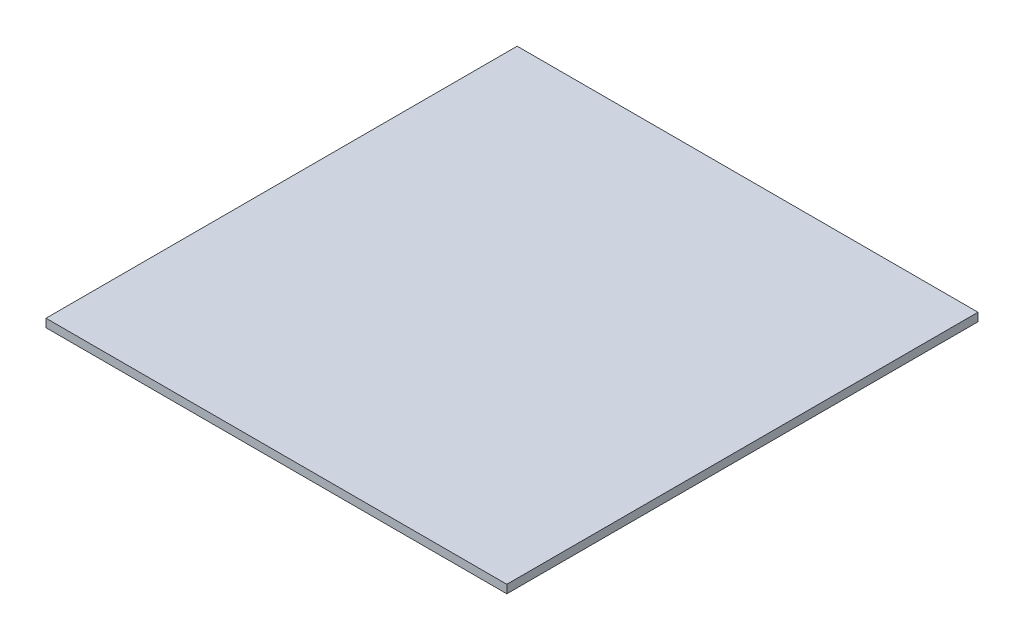
ISO-10303-21;
HEADER;
FILE_DESCRIPTION(('STEP AP214'),'2;1');
FILE_NAME('part.step','',(''),(''),'','','');
FILE_SCHEMA(('AUTOMOTIVE_DESIGN { 1 0 10303 214 1 1 1 1 }'));
ENDSEC;
DATA;
#1=APPLICATION_CONTEXT('core data for automotive mechanical design processes');
#2=APPLICATION_PROTOCOL_DEFINITION('international standard','automotive_design',2000,#1);
#3=PRODUCT_CONTEXT('',#1,'mechanical');
#4=PRODUCT('Part','Part','',(#3));
#5=PRODUCT_RELATED_PRODUCT_CATEGORY('part','',(#4));
#6=PRODUCT_DEFINITION_FORMATION('','',#4);
#7=PRODUCT_DEFINITION_CONTEXT('part definition',#1,'design');
#8=PRODUCT_DEFINITION('design','',#6,#7);
#9=PRODUCT_DEFINITION_SHAPE('','',#8);
#10=(LENGTH_UNIT() NAMED_UNIT(*) SI_UNIT(.MILLI.,.METRE.));
#11=(NAMED_UNIT(*) PLANE_ANGLE_UNIT() SI_UNIT($,.RADIAN.));
#12=(NAMED_UNIT(*) SI_UNIT($,.STERADIAN.) SOLID_ANGLE_UNIT());
#13=UNCERTAINTY_MEASURE_WITH_UNIT(LENGTH_MEASURE(1.E-05),#10,'distance_accuracy_value','');
#14=(GEOMETRIC_REPRESENTATION_CONTEXT(3) GLOBAL_UNCERTAINTY_ASSIGNED_CONTEXT((#13)) GLOBAL_UNIT_ASSIGNED_CONTEXT((#10,
#11,#12)) REPRESENTATION_CONTEXT('',''));
#15=CARTESIAN_POINT('',(0.,0.,0.));
#16=DIRECTION('',(0.,0.,1.));
#17=DIRECTION('',(1.,0.,0.));
#18=AXIS2_PLACEMENT_3D('',#15,#16,#17);
#19=CARTESIAN_POINT('',(0.,8.,0.));
#20=DIRECTION('',(1.,0.,0.));
#21=DIRECTION('',(0.,0.,-1.));
#22=AXIS2_PLACEMENT_3D('',#19,#20,#21);
#23=PLANE('',#22);
#24=DIRECTION('',(0.,0.,1.));
#25=VECTOR('',#24,1.);
#26=CARTESIAN_POINT('',(0.,0.,0.));
#27=LINE('',#26,#25);
#28=CARTESIAN_POINT('',(0.,0.,-455.));
#29=VERTEX_POINT('',#28);
#30=CARTESIAN_POINT('',(0.,0.,0.));
#31=VERTEX_POINT('',#30);
#32=EDGE_CURVE('E96',#29,#31,#27,.T.);
#33=ORIENTED_EDGE('',*,*,#32,.T.);
#34=DIRECTION('',(0.,-1.,0.));
#35=VECTOR('',#34,1.);
#36=CARTESIAN_POINT('',(0.,8.,0.));
#37=LINE('',#36,#35);
#38=CARTESIAN_POINT('',(0.,8.,0.));
#39=VERTEX_POINT('',#38);
#40=EDGE_CURVE('E11',#39,#31,#37,.T.);
#41=ORIENTED_EDGE('',*,*,#40,.F.);
#42=DIRECTION('',(0.,0.,1.));
#43=VECTOR('',#42,1.);
#44=CARTESIAN_POINT('',(0.,8.,0.));
#45=LINE('',#44,#43);
#46=CARTESIAN_POINT('',(0.,8.,-455.));
#47=VERTEX_POINT('',#46);
#48=EDGE_CURVE('E84',#47,#39,#45,.T.);
#49=ORIENTED_EDGE('',*,*,#48,.F.);
#50=DIRECTION('',(0.,-1.,0.));
#51=VECTOR('',#50,1.);
#52=CARTESIAN_POINT('',(0.,8.,-455.));
#53=LINE('',#52,#51);
#54=EDGE_CURVE('E92',#47,#29,#53,.T.);
#55=ORIENTED_EDGE('',*,*,#54,.T.);
#56=EDGE_LOOP('',(#33,#41,#49,#55));
#57=FACE_BOUND('',#56,.T.);
#58=ADVANCED_FACE('F33',(#57),#23,.F.);
#59=CARTESIAN_POINT('',(0.,8.,0.));
#60=DIRECTION('',(0.,0.,-1.));
#61=DIRECTION('',(-1.,0.,0.));
#62=AXIS2_PLACEMENT_3D('',#59,#60,#61);
#63=PLANE('',#62);
#64=DIRECTION('',(1.,0.,0.));
#65=VECTOR('',#64,1.);
#66=CARTESIAN_POINT('',(0.,0.,0.));
#67=LINE('',#66,#65);
#68=CARTESIAN_POINT('',(445.,0.,0.));
#69=VERTEX_POINT('',#68);
#70=EDGE_CURVE('E88',#31,#69,#67,.T.);
#71=ORIENTED_EDGE('',*,*,#70,.T.);
#72=DIRECTION('',(0.,-1.,0.));
#73=VECTOR('',#72,1.);
#74=CARTESIAN_POINT('',(445.,8.,0.));
#75=LINE('',#74,#73);
#76=CARTESIAN_POINT('',(445.,8.,0.));
#77=VERTEX_POINT('',#76);
#78=EDGE_CURVE('E41',#77,#69,#75,.T.);
#79=ORIENTED_EDGE('',*,*,#78,.F.);
#80=DIRECTION('',(1.,0.,0.));
#81=VECTOR('',#80,1.);
#82=CARTESIAN_POINT('',(0.,8.,0.));
#83=LINE('',#82,#81);
#84=EDGE_CURVE('E79',#39,#77,#83,.T.);
#85=ORIENTED_EDGE('',*,*,#84,.F.);
#86=ORIENTED_EDGE('',*,*,#40,.T.);
#87=EDGE_LOOP('',(#71,#79,#85,#86));
#88=FACE_BOUND('',#87,.T.);
#89=ADVANCED_FACE('F87',(#88),#63,.F.);
#90=CARTESIAN_POINT('',(445.,8.,0.));
#91=DIRECTION('',(-1.,0.,0.));
#92=DIRECTION('',(0.,0.,1.));
#93=AXIS2_PLACEMENT_3D('',#90,#91,#92);
#94=PLANE('',#93);
#95=DIRECTION('',(0.,0.,-1.));
#96=VECTOR('',#95,1.);
#97=CARTESIAN_POINT('',(445.,0.,0.));
#98=LINE('',#97,#96);
#99=CARTESIAN_POINT('',(445.,0.,-455.));
#100=VERTEX_POINT('',#99);
#101=EDGE_CURVE('E66',#69,#100,#98,.T.);
#102=ORIENTED_EDGE('',*,*,#101,.T.);
#103=DIRECTION('',(0.,-1.,0.));
#104=VECTOR('',#103,1.);
#105=CARTESIAN_POINT('',(445.,8.,-455.));
#106=LINE('',#105,#104);
#107=CARTESIAN_POINT('',(445.,8.,-455.));
#108=VERTEX_POINT('',#107);
#109=EDGE_CURVE('E89',#108,#100,#106,.T.);
#110=ORIENTED_EDGE('',*,*,#109,.F.);
#111=DIRECTION('',(0.,0.,-1.));
#112=VECTOR('',#111,1.);
#113=CARTESIAN_POINT('',(445.,8.,0.));
#114=LINE('',#113,#112);
#115=EDGE_CURVE('E82',#77,#108,#114,.T.);
#116=ORIENTED_EDGE('',*,*,#115,.F.);
#117=ORIENTED_EDGE('',*,*,#78,.T.);
#118=EDGE_LOOP('',(#102,#110,#116,#117));
#119=FACE_BOUND('',#118,.T.);
#120=ADVANCED_FACE('F90',(#119),#94,.F.);
#121=CARTESIAN_POINT('',(0.,8.,-455.));
#122=DIRECTION('',(0.,0.,1.));
#123=DIRECTION('',(1.,0.,0.));
#124=AXIS2_PLACEMENT_3D('',#121,#122,#123);
#125=PLANE('',#124);
#126=DIRECTION('',(-1.,0.,0.));
#127=VECTOR('',#126,1.);
#128=CARTESIAN_POINT('',(0.,0.,-455.));
#129=LINE('',#128,#127);
#130=EDGE_CURVE('E72',#100,#29,#129,.T.);
#131=ORIENTED_EDGE('',*,*,#130,.T.);
#132=ORIENTED_EDGE('',*,*,#54,.F.);
#133=DIRECTION('',(-1.,0.,0.));
#134=VECTOR('',#133,1.);
#135=CARTESIAN_POINT('',(0.,8.,-455.));
#136=LINE('',#135,#134);
#137=EDGE_CURVE('E49',#108,#47,#136,.T.);
#138=ORIENTED_EDGE('',*,*,#137,.F.);
#139=ORIENTED_EDGE('',*,*,#109,.T.);
#140=EDGE_LOOP('',(#131,#132,#138,#139));
#141=FACE_BOUND('',#140,.T.);
#142=ADVANCED_FACE('F103',(#141),#125,.F.);
#143=CARTESIAN_POINT('',(0.,8.,0.));
#144=DIRECTION('',(0.,-1.,0.));
#145=DIRECTION('',(0.,0.,-1.));
#146=AXIS2_PLACEMENT_3D('',#143,#144,#145);
#147=PLANE('',#146);
#148=ORIENTED_EDGE('',*,*,#48,.T.);
#149=ORIENTED_EDGE('',*,*,#84,.T.);
#150=ORIENTED_EDGE('',*,*,#115,.T.);
#151=ORIENTED_EDGE('',*,*,#137,.T.);
#152=EDGE_LOOP('',(#148,#149,#150,#151));
#153=FACE_BOUND('',#152,.T.);
#154=ADVANCED_FACE('F80',(#153),#147,.F.);
#155=CARTESIAN_POINT('',(0.,0.,0.));
#156=DIRECTION('',(0.,-1.,0.));
#157=DIRECTION('',(0.,0.,-1.));
#158=AXIS2_PLACEMENT_3D('',#155,#156,#157);
#159=PLANE('',#158);
#160=ORIENTED_EDGE('',*,*,#32,.F.);
#161=ORIENTED_EDGE('',*,*,#130,.F.);
#162=ORIENTED_EDGE('',*,*,#101,.F.);
#163=ORIENTED_EDGE('',*,*,#70,.F.);
#164=EDGE_LOOP('',(#160,#161,#162,#163));
#165=FACE_BOUND('',#164,.T.);
#166=ADVANCED_FACE('F106',(#165),#159,.T.);
#167=CLOSED_SHELL('',(#58,#89,#120,#142,#154,#166));
#168=MANIFOLD_SOLID_BREP('B2',#167);
#169=ADVANCED_BREP_SHAPE_REPRESENTATION('',(#18,#168),#14);
#170=SHAPE_DEFINITION_REPRESENTATION(#9,#169);
ENDSEC;
END-ISO-10303-21;
